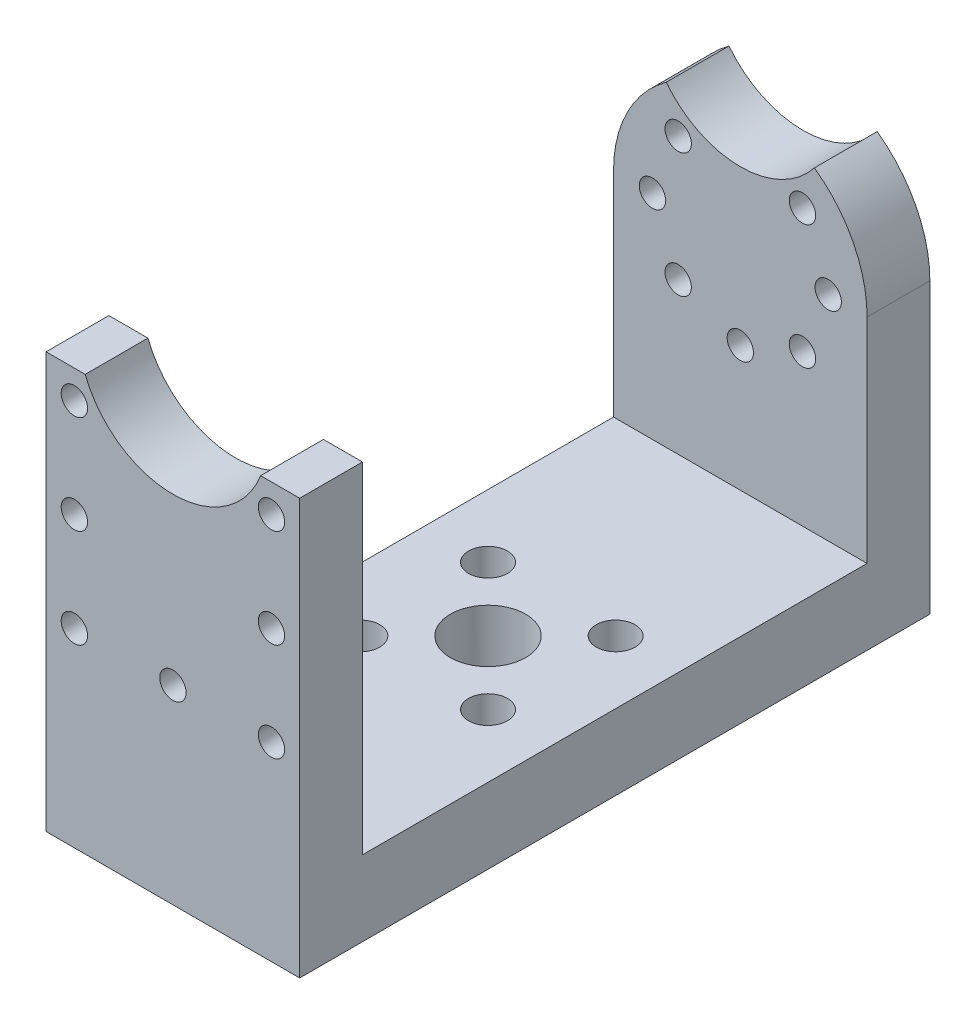
ISO-10303-21;
HEADER;
FILE_DESCRIPTION(('STEP AP214'),'2;1');
FILE_NAME('part.step','',(''),(''),'','','');
FILE_SCHEMA(('AUTOMOTIVE_DESIGN { 1 0 10303 214 1 1 1 1 }'));
ENDSEC;
DATA;
#1=APPLICATION_CONTEXT('core data for automotive mechanical design processes');
#2=APPLICATION_PROTOCOL_DEFINITION('international standard','automotive_design',2000,#1);
#3=PRODUCT_CONTEXT('',#1,'mechanical');
#4=PRODUCT('Part','Part','',(#3));
#5=PRODUCT_RELATED_PRODUCT_CATEGORY('part','',(#4));
#6=PRODUCT_DEFINITION_FORMATION('','',#4);
#7=PRODUCT_DEFINITION_CONTEXT('part definition',#1,'design');
#8=PRODUCT_DEFINITION('design','',#6,#7);
#9=PRODUCT_DEFINITION_SHAPE('','',#8);
#10=(LENGTH_UNIT() NAMED_UNIT(*) SI_UNIT(.MILLI.,.METRE.));
#11=(NAMED_UNIT(*) PLANE_ANGLE_UNIT() SI_UNIT($,.RADIAN.));
#12=(NAMED_UNIT(*) SI_UNIT($,.STERADIAN.) SOLID_ANGLE_UNIT());
#13=UNCERTAINTY_MEASURE_WITH_UNIT(LENGTH_MEASURE(1.E-05),#10,'distance_accuracy_value','');
#14=(GEOMETRIC_REPRESENTATION_CONTEXT(3) GLOBAL_UNCERTAINTY_ASSIGNED_CONTEXT((#13)) GLOBAL_UNIT_ASSIGNED_CONTEXT((#10,
#11,#12)) REPRESENTATION_CONTEXT('',''));
#15=CARTESIAN_POINT('',(0.,0.,0.));
#16=DIRECTION('',(0.,0.,1.));
#17=DIRECTION('',(1.,0.,0.));
#18=AXIS2_PLACEMENT_3D('',#15,#16,#17);
#19=CARTESIAN_POINT('',(0.,0.,50.2));
#20=DIRECTION('',(0.,0.,-1.));
#21=DIRECTION('',(-1.,0.,0.));
#22=AXIS2_PLACEMENT_3D('',#19,#20,#21);
#23=CYLINDRICAL_SURFACE('',#22,10.1);
#24=CARTESIAN_POINT('',(0.,0.,0.));
#25=DIRECTION('',(0.,0.,1.));
#26=DIRECTION('',(1.,0.,0.));
#27=AXIS2_PLACEMENT_3D('',#24,#25,#26);
#28=CIRCLE('',#27,10.1);
#29=CARTESIAN_POINT('',(10.1,0.,0.));
#30=VERTEX_POINT('',#29);
#31=CARTESIAN_POINT('',(5.90395674610825,8.19471138845554,0.));
#32=VERTEX_POINT('',#31);
#33=EDGE_CURVE('E261',#30,#32,#28,.T.);
#34=ORIENTED_EDGE('',*,*,#33,.T.);
#35=DIRECTION('',(0.,0.,-1.));
#36=VECTOR('',#35,1.);
#37=CARTESIAN_POINT('',(5.90395674610825,8.19471138845554,0.));
#38=LINE('',#37,#36);
#39=CARTESIAN_POINT('',(5.90395674610825,8.19471138845554,5.));
#40=VERTEX_POINT('',#39);
#41=EDGE_CURVE('E164',#32,#40,#38,.F.);
#42=ORIENTED_EDGE('',*,*,#41,.T.);
#43=CARTESIAN_POINT('',(0.,0.,5.));
#44=DIRECTION('',(0.,0.,-1.));
#45=DIRECTION('',(0.,1.,0.));
#46=AXIS2_PLACEMENT_3D('',#43,#44,#45);
#47=CIRCLE('',#46,10.1);
#48=CARTESIAN_POINT('',(10.1,0.,5.));
#49=VERTEX_POINT('',#48);
#50=EDGE_CURVE('E253',#40,#49,#47,.T.);
#51=ORIENTED_EDGE('',*,*,#50,.T.);
#52=DIRECTION('',(0.,0.,-1.));
#53=VECTOR('',#52,1.);
#54=CARTESIAN_POINT('',(10.1,0.,50.2));
#55=LINE('',#54,#53);
#56=EDGE_CURVE('E137',#49,#30,#55,.T.);
#57=ORIENTED_EDGE('',*,*,#56,.T.);
#58=EDGE_LOOP('',(#34,#42,#51,#57));
#59=FACE_BOUND('',#58,.T.);
#60=ADVANCED_FACE('F35',(#59),#23,.T.);
#61=CARTESIAN_POINT('',(-10.1,10.1,45.2));
#62=DIRECTION('',(0.,1.,0.));
#63=DIRECTION('',(0.,0.,1.));
#64=AXIS2_PLACEMENT_3D('',#61,#62,#63);
#65=PLANE('',#64);
#66=DIRECTION('',(0.,0.,1.));
#67=VECTOR('',#66,1.);
#68=CARTESIAN_POINT('',(-6.98939196210944,10.1,39.2));
#69=LINE('',#68,#67);
#70=CARTESIAN_POINT('',(-6.98939196210944,10.1,45.2));
#71=VERTEX_POINT('',#70);
#72=CARTESIAN_POINT('',(-6.98939196210944,10.1,50.2));
#73=VERTEX_POINT('',#72);
#74=EDGE_CURVE('E44',#71,#73,#69,.T.);
#75=ORIENTED_EDGE('',*,*,#74,.F.);
#76=DIRECTION('',(-1.,0.,0.));
#77=VECTOR('',#76,1.);
#78=CARTESIAN_POINT('',(-10.1,10.1,45.2));
#79=LINE('',#78,#77);
#80=CARTESIAN_POINT('',(-10.1,10.1,45.2));
#81=VERTEX_POINT('',#80);
#82=EDGE_CURVE('E235',#71,#81,#79,.T.);
#83=ORIENTED_EDGE('',*,*,#82,.T.);
#84=DIRECTION('',(0.,0.,1.));
#85=VECTOR('',#84,1.);
#86=CARTESIAN_POINT('',(-10.1,10.1,45.2));
#87=LINE('',#86,#85);
#88=CARTESIAN_POINT('',(-10.1,10.1,50.2));
#89=VERTEX_POINT('',#88);
#90=EDGE_CURVE('E234',#81,#89,#87,.T.);
#91=ORIENTED_EDGE('',*,*,#90,.T.);
#92=DIRECTION('',(-1.,0.,0.));
#93=VECTOR('',#92,1.);
#94=CARTESIAN_POINT('',(-10.1,10.1,50.2));
#95=LINE('',#94,#93);
#96=EDGE_CURVE('E230',#73,#89,#95,.T.);
#97=ORIENTED_EDGE('',*,*,#96,.F.);
#98=EDGE_LOOP('',(#75,#83,#91,#97));
#99=FACE_BOUND('',#98,.T.);
#100=ADVANCED_FACE('F396',(#99),#65,.T.);
#101=CARTESIAN_POINT('',(-10.1,0.,5.));
#102=VERTEX_POINT('',#101);
#103=CARTESIAN_POINT('',(-5.90395674610825,8.19471138845554,5.));
#104=VERTEX_POINT('',#103);
#105=EDGE_CURVE('E255',#102,#104,#47,.T.);
#106=ORIENTED_EDGE('',*,*,#105,.T.);
#107=DIRECTION('',(0.,0.,-1.));
#108=VECTOR('',#107,1.);
#109=CARTESIAN_POINT('',(-5.90395674610825,8.19471138845554,0.));
#110=LINE('',#109,#108);
#111=CARTESIAN_POINT('',(-5.90395674610825,8.19471138845554,0.));
#112=VERTEX_POINT('',#111);
#113=EDGE_CURVE('E52',#104,#112,#110,.T.);
#114=ORIENTED_EDGE('',*,*,#113,.T.);
#115=CARTESIAN_POINT('',(-10.1,0.,0.));
#116=VERTEX_POINT('',#115);
#117=EDGE_CURVE('E258',#112,#116,#28,.T.);
#118=ORIENTED_EDGE('',*,*,#117,.T.);
#119=DIRECTION('',(0.,0.,-1.));
#120=VECTOR('',#119,1.);
#121=CARTESIAN_POINT('',(-10.1,0.,50.2));
#122=LINE('',#121,#120);
#123=EDGE_CURVE('E268',#102,#116,#122,.T.);
#124=ORIENTED_EDGE('',*,*,#123,.F.);
#125=EDGE_LOOP('',(#106,#114,#118,#124));
#126=FACE_BOUND('',#125,.T.);
#127=ADVANCED_FACE('F37',(#126),#23,.T.);
#128=CARTESIAN_POINT('',(-10.1,0.,50.2));
#129=DIRECTION('',(1.,0.,0.));
#130=DIRECTION('',(0.,0.,-1.));
#131=AXIS2_PLACEMENT_3D('',#128,#129,#130);
#132=PLANE('',#131);
#133=DIRECTION('',(0.,-1.,0.));
#134=VECTOR('',#133,1.);
#135=CARTESIAN_POINT('',(-10.1,0.,50.2));
#136=LINE('',#135,#134);
#137=CARTESIAN_POINT('',(-10.1,-23.,50.2));
#138=VERTEX_POINT('',#137);
#139=EDGE_CURVE('E138',#89,#138,#136,.T.);
#140=ORIENTED_EDGE('',*,*,#139,.F.);
#141=ORIENTED_EDGE('',*,*,#90,.F.);
#142=DIRECTION('',(0.,1.,0.));
#143=VECTOR('',#142,1.);
#144=CARTESIAN_POINT('',(-10.1,-17.,45.2));
#145=LINE('',#144,#143);
#146=CARTESIAN_POINT('',(-10.1,-17.,45.2));
#147=VERTEX_POINT('',#146);
#148=EDGE_CURVE('E247',#147,#81,#145,.T.);
#149=ORIENTED_EDGE('',*,*,#148,.F.);
#150=DIRECTION('',(0.,0.,1.));
#151=VECTOR('',#150,1.);
#152=CARTESIAN_POINT('',(-10.1,-17.,5.));
#153=LINE('',#152,#151);
#154=CARTESIAN_POINT('',(-10.1,-17.,5.));
#155=VERTEX_POINT('',#154);
#156=EDGE_CURVE('E244',#155,#147,#153,.T.);
#157=ORIENTED_EDGE('',*,*,#156,.F.);
#158=DIRECTION('',(0.,-1.,0.));
#159=VECTOR('',#158,1.);
#160=CARTESIAN_POINT('',(-10.1,-10.,5.));
#161=LINE('',#160,#159);
#162=EDGE_CURVE('E239',#102,#155,#161,.T.);
#163=ORIENTED_EDGE('',*,*,#162,.F.);
#164=ORIENTED_EDGE('',*,*,#123,.T.);
#165=DIRECTION('',(0.,-1.,0.));
#166=VECTOR('',#165,1.);
#167=CARTESIAN_POINT('',(-10.1,0.,0.));
#168=LINE('',#167,#166);
#169=CARTESIAN_POINT('',(-10.1,-23.,0.));
#170=VERTEX_POINT('',#169);
#171=EDGE_CURVE('E264',#116,#170,#168,.T.);
#172=ORIENTED_EDGE('',*,*,#171,.T.);
#173=DIRECTION('',(0.,0.,-1.));
#174=VECTOR('',#173,1.);
#175=CARTESIAN_POINT('',(-10.1,-23.,0.));
#176=LINE('',#175,#174);
#177=EDGE_CURVE('E148',#138,#170,#176,.T.);
#178=ORIENTED_EDGE('',*,*,#177,.F.);
#179=EDGE_LOOP('',(#140,#141,#149,#157,#163,#164,#172,#178));
#180=FACE_BOUND('',#179,.T.);
#181=ADVANCED_FACE('F380',(#180),#132,.F.);
#182=CARTESIAN_POINT('',(10.1,0.,50.2));
#183=DIRECTION('',(-1.,0.,0.));
#184=DIRECTION('',(0.,0.,1.));
#185=AXIS2_PLACEMENT_3D('',#182,#183,#184);
#186=PLANE('',#185);
#187=DIRECTION('',(0.,0.,1.));
#188=VECTOR('',#187,1.);
#189=CARTESIAN_POINT('',(10.1,-17.,50.2));
#190=LINE('',#189,#188);
#191=CARTESIAN_POINT('',(10.1,-17.,5.));
#192=VERTEX_POINT('',#191);
#193=CARTESIAN_POINT('',(10.1,-17.,45.2));
#194=VERTEX_POINT('',#193);
#195=EDGE_CURVE('E274',#192,#194,#190,.T.);
#196=ORIENTED_EDGE('',*,*,#195,.T.);
#197=DIRECTION('',(0.,1.,0.));
#198=VECTOR('',#197,1.);
#199=CARTESIAN_POINT('',(10.1,0.,45.2));
#200=LINE('',#199,#198);
#201=CARTESIAN_POINT('',(10.1,10.1,45.2));
#202=VERTEX_POINT('',#201);
#203=EDGE_CURVE('E276',#194,#202,#200,.T.);
#204=ORIENTED_EDGE('',*,*,#203,.T.);
#205=DIRECTION('',(0.,0.,1.));
#206=VECTOR('',#205,1.);
#207=CARTESIAN_POINT('',(10.1,10.1,45.2));
#208=LINE('',#207,#206);
#209=CARTESIAN_POINT('',(10.1,10.1,50.2));
#210=VERTEX_POINT('',#209);
#211=EDGE_CURVE('E134',#202,#210,#208,.T.);
#212=ORIENTED_EDGE('',*,*,#211,.T.);
#213=DIRECTION('',(0.,1.,0.));
#214=VECTOR('',#213,1.);
#215=CARTESIAN_POINT('',(10.1,0.,50.2));
#216=LINE('',#215,#214);
#217=CARTESIAN_POINT('',(10.1,-23.,50.2));
#218=VERTEX_POINT('',#217);
#219=EDGE_CURVE('E126',#218,#210,#216,.T.);
#220=ORIENTED_EDGE('',*,*,#219,.F.);
#221=DIRECTION('',(0.,0.,1.));
#222=VECTOR('',#221,1.);
#223=CARTESIAN_POINT('',(10.1,-23.,0.));
#224=LINE('',#223,#222);
#225=CARTESIAN_POINT('',(10.1,-23.,0.));
#226=VERTEX_POINT('',#225);
#227=EDGE_CURVE('E132',#226,#218,#224,.T.);
#228=ORIENTED_EDGE('',*,*,#227,.F.);
#229=DIRECTION('',(0.,1.,0.));
#230=VECTOR('',#229,1.);
#231=CARTESIAN_POINT('',(10.1,0.,0.));
#232=LINE('',#231,#230);
#233=EDGE_CURVE('E259',#226,#30,#232,.T.);
#234=ORIENTED_EDGE('',*,*,#233,.T.);
#235=ORIENTED_EDGE('',*,*,#56,.F.);
#236=DIRECTION('',(0.,-1.,0.));
#237=VECTOR('',#236,1.);
#238=CARTESIAN_POINT('',(10.1,0.,5.));
#239=LINE('',#238,#237);
#240=EDGE_CURVE('E271',#49,#192,#239,.T.);
#241=ORIENTED_EDGE('',*,*,#240,.T.);
#242=EDGE_LOOP('',(#196,#204,#212,#220,#228,#234,#235,#241));
#243=FACE_BOUND('',#242,.T.);
#244=ADVANCED_FACE('F129',(#243),#186,.F.);
#245=CARTESIAN_POINT('',(0.,0.,50.2));
#246=DIRECTION('',(0.,0.,1.));
#247=DIRECTION('',(1.,0.,0.));
#248=AXIS2_PLACEMENT_3D('',#245,#246,#247);
#249=PLANE('',#248);
#250=CARTESIAN_POINT('',(0.,12.82,50.2));
#251=DIRECTION('',(0.,0.,1.));
#252=DIRECTION('',(1.,0.,0.));
#253=AXIS2_PLACEMENT_3D('',#250,#251,#252);
#254=CIRCLE('',#253,7.5);
#255=CARTESIAN_POINT('',(6.98939196210944,10.1,50.2));
#256=VERTEX_POINT('',#255);
#257=EDGE_CURVE('E59',#73,#256,#254,.T.);
#258=ORIENTED_EDGE('',*,*,#257,.F.);
#259=ORIENTED_EDGE('',*,*,#96,.T.);
#260=ORIENTED_EDGE('',*,*,#139,.T.);
#261=DIRECTION('',(-1.,0.,0.));
#262=VECTOR('',#261,1.);
#263=CARTESIAN_POINT('',(10.1,-23.,50.2));
#264=LINE('',#263,#262);
#265=EDGE_CURVE('E141',#218,#138,#264,.T.);
#266=ORIENTED_EDGE('',*,*,#265,.F.);
#267=ORIENTED_EDGE('',*,*,#219,.T.);
#268=EDGE_CURVE('E236',#210,#256,#95,.T.);
#269=ORIENTED_EDGE('',*,*,#268,.T.);
#270=EDGE_LOOP('',(#258,#259,#260,#266,#267,#269));
#271=FACE_BOUND('',#270,.T.);
#272=CARTESIAN_POINT('',(7.85,-7.85,50.2));
#273=DIRECTION('',(0.,0.,1.));
#274=DIRECTION('',(1.,0.,0.));
#275=AXIS2_PLACEMENT_3D('',#272,#273,#274);
#276=CIRCLE('',#275,1.05);
#277=CARTESIAN_POINT('',(8.9,-7.85,50.2));
#278=VERTEX_POINT('',#277);
#279=EDGE_CURVE('E227',#278,#278,#276,.T.);
#280=ORIENTED_EDGE('',*,*,#279,.F.);
#281=EDGE_LOOP('',(#280));
#282=FACE_BOUND('',#281,.T.);
#283=CARTESIAN_POINT('',(-7.85,-7.85,50.2));
#284=DIRECTION('',(0.,0.,1.));
#285=DIRECTION('',(1.,0.,0.));
#286=AXIS2_PLACEMENT_3D('',#283,#284,#285);
#287=CIRCLE('',#286,1.05);
#288=CARTESIAN_POINT('',(-6.8,-7.85,50.2));
#289=VERTEX_POINT('',#288);
#290=EDGE_CURVE('E223',#289,#289,#287,.T.);
#291=ORIENTED_EDGE('',*,*,#290,.F.);
#292=EDGE_LOOP('',(#291));
#293=FACE_BOUND('',#292,.T.);
#294=CARTESIAN_POINT('',(7.85,7.85,50.2));
#295=DIRECTION('',(0.,0.,1.));
#296=DIRECTION('',(1.,0.,0.));
#297=AXIS2_PLACEMENT_3D('',#294,#295,#296);
#298=CIRCLE('',#297,1.05);
#299=CARTESIAN_POINT('',(8.9,7.85,50.2));
#300=VERTEX_POINT('',#299);
#301=EDGE_CURVE('E219',#300,#300,#298,.T.);
#302=ORIENTED_EDGE('',*,*,#301,.F.);
#303=EDGE_LOOP('',(#302));
#304=FACE_BOUND('',#303,.T.);
#305=CARTESIAN_POINT('',(0.,-7.85,50.2));
#306=DIRECTION('',(0.,0.,1.));
#307=DIRECTION('',(1.,0.,0.));
#308=AXIS2_PLACEMENT_3D('',#305,#306,#307);
#309=CIRCLE('',#308,1.05);
#310=CARTESIAN_POINT('',(1.05,-7.85,50.2));
#311=VERTEX_POINT('',#310);
#312=EDGE_CURVE('E215',#311,#311,#309,.T.);
#313=ORIENTED_EDGE('',*,*,#312,.F.);
#314=EDGE_LOOP('',(#313));
#315=FACE_BOUND('',#314,.T.);
#316=CARTESIAN_POINT('',(-7.85,0.,50.2));
#317=DIRECTION('',(0.,0.,1.));
#318=DIRECTION('',(1.,0.,0.));
#319=AXIS2_PLACEMENT_3D('',#316,#317,#318);
#320=CIRCLE('',#319,1.05);
#321=CARTESIAN_POINT('',(-6.8,0.,50.2));
#322=VERTEX_POINT('',#321);
#323=EDGE_CURVE('E211',#322,#322,#320,.T.);
#324=ORIENTED_EDGE('',*,*,#323,.F.);
#325=EDGE_LOOP('',(#324));
#326=FACE_BOUND('',#325,.T.);
#327=CARTESIAN_POINT('',(7.85,0.,50.2));
#328=DIRECTION('',(0.,0.,1.));
#329=DIRECTION('',(1.,0.,0.));
#330=AXIS2_PLACEMENT_3D('',#327,#328,#329);
#331=CIRCLE('',#330,1.05);
#332=CARTESIAN_POINT('',(8.9,0.,50.2));
#333=VERTEX_POINT('',#332);
#334=EDGE_CURVE('E207',#333,#333,#331,.T.);
#335=ORIENTED_EDGE('',*,*,#334,.F.);
#336=EDGE_LOOP('',(#335));
#337=FACE_BOUND('',#336,.T.);
#338=CARTESIAN_POINT('',(-7.85,7.85,50.2));
#339=DIRECTION('',(0.,0.,1.));
#340=DIRECTION('',(1.,0.,0.));
#341=AXIS2_PLACEMENT_3D('',#338,#339,#340);
#342=CIRCLE('',#341,1.05);
#343=CARTESIAN_POINT('',(-6.8,7.85,50.2));
#344=VERTEX_POINT('',#343);
#345=EDGE_CURVE('E203',#344,#344,#342,.T.);
#346=ORIENTED_EDGE('',*,*,#345,.F.);
#347=EDGE_LOOP('',(#346));
#348=FACE_BOUND('',#347,.T.);
#349=ADVANCED_FACE('F142',(#271,#282,#293,#304,#315,#326,#337,#348),#249,.T.);
#350=CARTESIAN_POINT('',(0.,0.,0.));
#351=DIRECTION('',(0.,0.,1.));
#352=DIRECTION('',(1.,0.,0.));
#353=AXIS2_PLACEMENT_3D('',#350,#351,#352);
#354=PLANE('',#353);
#355=CARTESIAN_POINT('',(4.94974746830575,4.94974746830562,0.));
#356=DIRECTION('',(0.,0.,1.));
#357=DIRECTION('',(1.,0.,0.));
#358=AXIS2_PLACEMENT_3D('',#355,#356,#357);
#359=CIRCLE('',#358,1.05000000000013);
#360=CARTESIAN_POINT('',(5.99974746830588,4.94974746830562,0.));
#361=VERTEX_POINT('',#360);
#362=EDGE_CURVE('E195',#361,#361,#359,.T.);
#363=ORIENTED_EDGE('',*,*,#362,.T.);
#364=EDGE_LOOP('',(#363));
#365=FACE_BOUND('',#364,.T.);
#366=CARTESIAN_POINT('',(6.9999999999997,-2.96284817120734E-13,0.));
#367=DIRECTION('',(0.,0.,1.));
#368=DIRECTION('',(1.,0.,0.));
#369=AXIS2_PLACEMENT_3D('',#366,#367,#368);
#370=CIRCLE('',#369,1.05000000000035);
#371=CARTESIAN_POINT('',(8.05000000000005,-2.96284817120734E-13,0.));
#372=VERTEX_POINT('',#371);
#373=EDGE_CURVE('E191',#372,#372,#370,.T.);
#374=ORIENTED_EDGE('',*,*,#373,.T.);
#375=EDGE_LOOP('',(#374));
#376=FACE_BOUND('',#375,.T.);
#377=CARTESIAN_POINT('',(4.94974746830533,-4.94974746830604,0.));
#378=DIRECTION('',(0.,0.,1.));
#379=DIRECTION('',(1.,0.,0.));
#380=AXIS2_PLACEMENT_3D('',#377,#378,#379);
#381=CIRCLE('',#380,1.05000000000051);
#382=CARTESIAN_POINT('',(5.99974746830584,-4.94974746830604,0.));
#383=VERTEX_POINT('',#382);
#384=EDGE_CURVE('E187',#383,#383,#381,.T.);
#385=ORIENTED_EDGE('',*,*,#384,.T.);
#386=EDGE_LOOP('',(#385));
#387=FACE_BOUND('',#386,.T.);
#388=CARTESIAN_POINT('',(-5.92569634241468E-13,-7.,0.));
#389=DIRECTION('',(0.,0.,1.));
#390=DIRECTION('',(1.,0.,0.));
#391=AXIS2_PLACEMENT_3D('',#388,#389,#390);
#392=CIRCLE('',#391,1.05000000000052);
#393=CARTESIAN_POINT('',(1.04999999999993,-7.,0.));
#394=VERTEX_POINT('',#393);
#395=EDGE_CURVE('E183',#394,#394,#392,.T.);
#396=ORIENTED_EDGE('',*,*,#395,.T.);
#397=EDGE_LOOP('',(#396));
#398=FACE_BOUND('',#397,.T.);
#399=CARTESIAN_POINT('',(-4.94974746830634,-4.94974746830562,0.));
#400=DIRECTION('',(0.,0.,1.));
#401=DIRECTION('',(1.,0.,0.));
#402=AXIS2_PLACEMENT_3D('',#399,#400,#401);
#403=CIRCLE('',#402,1.05000000000036);
#404=CARTESIAN_POINT('',(-3.89974746830598,-4.94974746830562,0.));
#405=VERTEX_POINT('',#404);
#406=EDGE_CURVE('E179',#405,#405,#403,.T.);
#407=ORIENTED_EDGE('',*,*,#406,.T.);
#408=EDGE_LOOP('',(#407));
#409=FACE_BOUND('',#408,.T.);
#410=CARTESIAN_POINT('',(-7.0000000000003,2.95427564361331E-13,0.));
#411=DIRECTION('',(0.,0.,1.));
#412=DIRECTION('',(1.,0.,0.));
#413=AXIS2_PLACEMENT_3D('',#410,#411,#412);
#414=CIRCLE('',#413,1.05000000000013);
#415=CARTESIAN_POINT('',(-5.95000000000017,2.95427564361331E-13,0.));
#416=VERTEX_POINT('',#415);
#417=EDGE_CURVE('E175',#416,#416,#414,.T.);
#418=ORIENTED_EDGE('',*,*,#417,.T.);
#419=EDGE_LOOP('',(#418));
#420=FACE_BOUND('',#419,.T.);
#421=CARTESIAN_POINT('',(-4.94974746830592,4.94974746830604,0.));
#422=DIRECTION('',(0.,0.,1.));
#423=DIRECTION('',(1.,0.,0.));
#424=AXIS2_PLACEMENT_3D('',#421,#422,#423);
#425=CIRCLE('',#424,1.04999999999994);
#426=CARTESIAN_POINT('',(-3.89974746830598,4.94974746830604,0.));
#427=VERTEX_POINT('',#426);
#428=EDGE_CURVE('E171',#427,#427,#425,.T.);
#429=ORIENTED_EDGE('',*,*,#428,.T.);
#430=EDGE_LOOP('',(#429));
#431=FACE_BOUND('',#430,.T.);
#432=ORIENTED_EDGE('',*,*,#117,.F.);
#433=CARTESIAN_POINT('',(0.,12.82,0.));
#434=DIRECTION('',(0.,0.,1.));
#435=DIRECTION('',(1.,0.,0.));
#436=AXIS2_PLACEMENT_3D('',#433,#434,#435);
#437=CIRCLE('',#436,7.5);
#438=EDGE_CURVE('E167',#112,#32,#437,.T.);
#439=ORIENTED_EDGE('',*,*,#438,.T.);
#440=ORIENTED_EDGE('',*,*,#33,.F.);
#441=ORIENTED_EDGE('',*,*,#233,.F.);
#442=DIRECTION('',(1.,0.,0.));
#443=VECTOR('',#442,1.);
#444=CARTESIAN_POINT('',(10.1,-23.,0.));
#445=LINE('',#444,#443);
#446=EDGE_CURVE('E153',#170,#226,#445,.T.);
#447=ORIENTED_EDGE('',*,*,#446,.F.);
#448=ORIENTED_EDGE('',*,*,#171,.F.);
#449=EDGE_LOOP('',(#432,#439,#440,#441,#447,#448));
#450=FACE_BOUND('',#449,.T.);
#451=ADVANCED_FACE('F390',(#365,#376,#387,#398,#409,#420,#431,#450),#354,.F.);
#452=CARTESIAN_POINT('',(34.1,-17.,45.2));
#453=DIRECTION('',(0.,0.,1.));
#454=DIRECTION('',(1.,0.,0.));
#455=AXIS2_PLACEMENT_3D('',#452,#453,#454);
#456=PLANE('',#455);
#457=CARTESIAN_POINT('',(7.85,-7.85,45.2));
#458=DIRECTION('',(0.,0.,1.));
#459=DIRECTION('',(1.,0.,0.));
#460=AXIS2_PLACEMENT_3D('',#457,#458,#459);
#461=CIRCLE('',#460,1.05);
#462=CARTESIAN_POINT('',(8.9,-7.85,45.2));
#463=VERTEX_POINT('',#462);
#464=EDGE_CURVE('E226',#463,#463,#461,.T.);
#465=ORIENTED_EDGE('',*,*,#464,.T.);
#466=EDGE_LOOP('',(#465));
#467=FACE_BOUND('',#466,.T.);
#468=CARTESIAN_POINT('',(-7.85,-7.85,45.2));
#469=DIRECTION('',(0.,0.,1.));
#470=DIRECTION('',(1.,0.,0.));
#471=AXIS2_PLACEMENT_3D('',#468,#469,#470);
#472=CIRCLE('',#471,1.05);
#473=CARTESIAN_POINT('',(-6.8,-7.85,45.2));
#474=VERTEX_POINT('',#473);
#475=EDGE_CURVE('E222',#474,#474,#472,.T.);
#476=ORIENTED_EDGE('',*,*,#475,.T.);
#477=EDGE_LOOP('',(#476));
#478=FACE_BOUND('',#477,.T.);
#479=CARTESIAN_POINT('',(7.85,7.85,45.2));
#480=DIRECTION('',(0.,0.,1.));
#481=DIRECTION('',(1.,0.,0.));
#482=AXIS2_PLACEMENT_3D('',#479,#480,#481);
#483=CIRCLE('',#482,1.05);
#484=CARTESIAN_POINT('',(8.9,7.85,45.2));
#485=VERTEX_POINT('',#484);
#486=EDGE_CURVE('E218',#485,#485,#483,.T.);
#487=ORIENTED_EDGE('',*,*,#486,.T.);
#488=EDGE_LOOP('',(#487));
#489=FACE_BOUND('',#488,.T.);
#490=CARTESIAN_POINT('',(0.,-7.85,45.2));
#491=DIRECTION('',(0.,0.,1.));
#492=DIRECTION('',(1.,0.,0.));
#493=AXIS2_PLACEMENT_3D('',#490,#491,#492);
#494=CIRCLE('',#493,1.05);
#495=CARTESIAN_POINT('',(1.05,-7.85,45.2));
#496=VERTEX_POINT('',#495);
#497=EDGE_CURVE('E214',#496,#496,#494,.T.);
#498=ORIENTED_EDGE('',*,*,#497,.T.);
#499=EDGE_LOOP('',(#498));
#500=FACE_BOUND('',#499,.T.);
#501=CARTESIAN_POINT('',(-7.85,0.,45.2));
#502=DIRECTION('',(0.,0.,1.));
#503=DIRECTION('',(1.,0.,0.));
#504=AXIS2_PLACEMENT_3D('',#501,#502,#503);
#505=CIRCLE('',#504,1.05);
#506=CARTESIAN_POINT('',(-6.8,0.,45.2));
#507=VERTEX_POINT('',#506);
#508=EDGE_CURVE('E210',#507,#507,#505,.T.);
#509=ORIENTED_EDGE('',*,*,#508,.T.);
#510=EDGE_LOOP('',(#509));
#511=FACE_BOUND('',#510,.T.);
#512=CARTESIAN_POINT('',(7.85,0.,45.2));
#513=DIRECTION('',(0.,0.,1.));
#514=DIRECTION('',(1.,0.,0.));
#515=AXIS2_PLACEMENT_3D('',#512,#513,#514);
#516=CIRCLE('',#515,1.05);
#517=CARTESIAN_POINT('',(8.9,0.,45.2));
#518=VERTEX_POINT('',#517);
#519=EDGE_CURVE('E206',#518,#518,#516,.T.);
#520=ORIENTED_EDGE('',*,*,#519,.T.);
#521=EDGE_LOOP('',(#520));
#522=FACE_BOUND('',#521,.T.);
#523=CARTESIAN_POINT('',(-7.85,7.85,45.2));
#524=DIRECTION('',(0.,0.,1.));
#525=DIRECTION('',(1.,0.,0.));
#526=AXIS2_PLACEMENT_3D('',#523,#524,#525);
#527=CIRCLE('',#526,1.05);
#528=CARTESIAN_POINT('',(-6.8,7.85,45.2));
#529=VERTEX_POINT('',#528);
#530=EDGE_CURVE('E202',#529,#529,#527,.T.);
#531=ORIENTED_EDGE('',*,*,#530,.T.);
#532=EDGE_LOOP('',(#531));
#533=FACE_BOUND('',#532,.T.);
#534=ORIENTED_EDGE('',*,*,#82,.F.);
#535=CARTESIAN_POINT('',(0.,12.82,45.2));
#536=DIRECTION('',(0.,0.,1.));
#537=DIRECTION('',(1.,0.,0.));
#538=AXIS2_PLACEMENT_3D('',#535,#536,#537);
#539=CIRCLE('',#538,7.5);
#540=CARTESIAN_POINT('',(6.98939196210944,10.1,45.2));
#541=VERTEX_POINT('',#540);
#542=EDGE_CURVE('E198',#71,#541,#539,.T.);
#543=ORIENTED_EDGE('',*,*,#542,.T.);
#544=EDGE_CURVE('E231',#202,#541,#79,.T.);
#545=ORIENTED_EDGE('',*,*,#544,.F.);
#546=ORIENTED_EDGE('',*,*,#203,.F.);
#547=DIRECTION('',(-1.,0.,0.));
#548=VECTOR('',#547,1.);
#549=CARTESIAN_POINT('',(34.1,-17.,45.2));
#550=LINE('',#549,#548);
#551=EDGE_CURVE('E251',#194,#147,#550,.T.);
#552=ORIENTED_EDGE('',*,*,#551,.T.);
#553=ORIENTED_EDGE('',*,*,#148,.T.);
#554=EDGE_LOOP('',(#534,#543,#545,#546,#552,#553));
#555=FACE_BOUND('',#554,.T.);
#556=ADVANCED_FACE('F363',(#467,#478,#489,#500,#511,#522,#533,#555),#456,.F.);
#557=CARTESIAN_POINT('',(34.1,-17.,5.));
#558=DIRECTION('',(0.,-1.,0.));
#559=DIRECTION('',(0.,0.,-1.));
#560=AXIS2_PLACEMENT_3D('',#557,#558,#559);
#561=PLANE('',#560);
#562=CARTESIAN_POINT('',(-5.08409775673116,-17.,30.1840977567312));
#563=DIRECTION('',(0.,1.,0.));
#564=DIRECTION('',(0.,0.,1.));
#565=AXIS2_PLACEMENT_3D('',#562,#563,#564);
#566=CIRCLE('',#565,1.54999999999999);
#567=CARTESIAN_POINT('',(-5.08409775673116,-17.,31.7340977567312));
#568=VERTEX_POINT('',#567);
#569=EDGE_CURVE('E353',#568,#568,#566,.T.);
#570=ORIENTED_EDGE('',*,*,#569,.F.);
#571=EDGE_LOOP('',(#570));
#572=FACE_BOUND('',#571,.T.);
#573=CARTESIAN_POINT('',(5.08409775673141,-17.,30.1840977567311));
#574=DIRECTION('',(0.,1.,0.));
#575=DIRECTION('',(0.,0.,1.));
#576=AXIS2_PLACEMENT_3D('',#573,#574,#575);
#577=CIRCLE('',#576,1.54999999999999);
#578=CARTESIAN_POINT('',(5.08409775673141,-17.,31.7340977567311));
#579=VERTEX_POINT('',#578);
#580=EDGE_CURVE('E349',#579,#579,#577,.T.);
#581=ORIENTED_EDGE('',*,*,#580,.F.);
#582=EDGE_LOOP('',(#581));
#583=FACE_BOUND('',#582,.T.);
#584=CARTESIAN_POINT('',(5.08409775673127,-17.,20.0159022432686));
#585=DIRECTION('',(0.,1.,0.));
#586=DIRECTION('',(0.,0.,1.));
#587=AXIS2_PLACEMENT_3D('',#584,#585,#586);
#588=CIRCLE('',#587,1.54999999999999);
#589=CARTESIAN_POINT('',(5.08409775673127,-17.,21.5659022432686));
#590=VERTEX_POINT('',#589);
#591=EDGE_CURVE('E344',#590,#590,#588,.T.);
#592=ORIENTED_EDGE('',*,*,#591,.F.);
#593=EDGE_LOOP('',(#592));
#594=FACE_BOUND('',#593,.T.);
#595=CARTESIAN_POINT('',(-5.0840977567313,-17.,20.0159022432687));
#596=DIRECTION('',(0.,1.,0.));
#597=DIRECTION('',(0.,0.,1.));
#598=AXIS2_PLACEMENT_3D('',#595,#596,#597);
#599=CIRCLE('',#598,1.54999999999999);
#600=CARTESIAN_POINT('',(-5.0840977567313,-17.,21.5659022432687));
#601=VERTEX_POINT('',#600);
#602=EDGE_CURVE('E342',#601,#601,#599,.T.);
#603=ORIENTED_EDGE('',*,*,#602,.F.);
#604=EDGE_LOOP('',(#603));
#605=FACE_BOUND('',#604,.T.);
#606=CARTESIAN_POINT('',(0.,-17.,25.1));
#607=DIRECTION('',(0.,1.,0.));
#608=DIRECTION('',(0.,0.,1.));
#609=AXIS2_PLACEMENT_3D('',#606,#607,#608);
#610=CIRCLE('',#609,3.);
#611=CARTESIAN_POINT('',(0.,-17.,28.1));
#612=VERTEX_POINT('',#611);
#613=EDGE_CURVE('E158',#612,#612,#610,.T.);
#614=ORIENTED_EDGE('',*,*,#613,.F.);
#615=EDGE_LOOP('',(#614));
#616=FACE_BOUND('',#615,.T.);
#617=DIRECTION('',(-1.,0.,0.));
#618=VECTOR('',#617,1.);
#619=CARTESIAN_POINT('',(34.1,-17.,5.));
#620=LINE('',#619,#618);
#621=EDGE_CURVE('E250',#192,#155,#620,.T.);
#622=ORIENTED_EDGE('',*,*,#621,.T.);
#623=ORIENTED_EDGE('',*,*,#156,.T.);
#624=ORIENTED_EDGE('',*,*,#551,.F.);
#625=ORIENTED_EDGE('',*,*,#195,.F.);
#626=EDGE_LOOP('',(#622,#623,#624,#625));
#627=FACE_BOUND('',#626,.T.);
#628=ADVANCED_FACE('F359',(#572,#583,#594,#605,#616,#627),#561,.F.);
#629=CARTESIAN_POINT('',(34.1,-10.,5.));
#630=DIRECTION('',(0.,0.,-1.));
#631=DIRECTION('',(0.,1.,0.));
#632=AXIS2_PLACEMENT_3D('',#629,#630,#631);
#633=PLANE('',#632);
#634=CARTESIAN_POINT('',(4.94974746830575,4.94974746830562,5.));
#635=DIRECTION('',(0.,0.,-1.));
#636=DIRECTION('',(0.,1.,0.));
#637=AXIS2_PLACEMENT_3D('',#634,#635,#636);
#638=CIRCLE('',#637,1.05000000000013);
#639=CARTESIAN_POINT('',(4.94974746830575,5.99974746830576,5.));
#640=VERTEX_POINT('',#639);
#641=EDGE_CURVE('E194',#640,#640,#638,.T.);
#642=ORIENTED_EDGE('',*,*,#641,.T.);
#643=EDGE_LOOP('',(#642));
#644=FACE_BOUND('',#643,.T.);
#645=CARTESIAN_POINT('',(6.9999999999997,-2.96284817120734E-13,5.));
#646=DIRECTION('',(0.,0.,-1.));
#647=DIRECTION('',(0.,1.,0.));
#648=AXIS2_PLACEMENT_3D('',#645,#646,#647);
#649=CIRCLE('',#648,1.05000000000035);
#650=CARTESIAN_POINT('',(6.9999999999997,1.05000000000005,5.));
#651=VERTEX_POINT('',#650);
#652=EDGE_CURVE('E190',#651,#651,#649,.T.);
#653=ORIENTED_EDGE('',*,*,#652,.T.);
#654=EDGE_LOOP('',(#653));
#655=FACE_BOUND('',#654,.T.);
#656=CARTESIAN_POINT('',(4.94974746830533,-4.94974746830604,5.));
#657=DIRECTION('',(0.,0.,-1.));
#658=DIRECTION('',(0.,1.,0.));
#659=AXIS2_PLACEMENT_3D('',#656,#657,#658);
#660=CIRCLE('',#659,1.05000000000051);
#661=CARTESIAN_POINT('',(4.94974746830533,-3.89974746830553,5.));
#662=VERTEX_POINT('',#661);
#663=EDGE_CURVE('E186',#662,#662,#660,.T.);
#664=ORIENTED_EDGE('',*,*,#663,.T.);
#665=EDGE_LOOP('',(#664));
#666=FACE_BOUND('',#665,.T.);
#667=CARTESIAN_POINT('',(-5.92569634241468E-13,-7.,5.));
#668=DIRECTION('',(0.,0.,-1.));
#669=DIRECTION('',(0.,1.,0.));
#670=AXIS2_PLACEMENT_3D('',#667,#668,#669);
#671=CIRCLE('',#670,1.05000000000052);
#672=CARTESIAN_POINT('',(-5.92569634241468E-13,-5.94999999999948,5.));
#673=VERTEX_POINT('',#672);
#674=EDGE_CURVE('E182',#673,#673,#671,.T.);
#675=ORIENTED_EDGE('',*,*,#674,.T.);
#676=EDGE_LOOP('',(#675));
#677=FACE_BOUND('',#676,.T.);
#678=CARTESIAN_POINT('',(-4.94974746830634,-4.94974746830562,5.));
#679=DIRECTION('',(0.,0.,-1.));
#680=DIRECTION('',(0.,1.,0.));
#681=AXIS2_PLACEMENT_3D('',#678,#679,#680);
#682=CIRCLE('',#681,1.05000000000036);
#683=CARTESIAN_POINT('',(-4.94974746830634,-3.89974746830526,5.));
#684=VERTEX_POINT('',#683);
#685=EDGE_CURVE('E178',#684,#684,#682,.T.);
#686=ORIENTED_EDGE('',*,*,#685,.T.);
#687=EDGE_LOOP('',(#686));
#688=FACE_BOUND('',#687,.T.);
#689=CARTESIAN_POINT('',(-7.0000000000003,2.95427564361331E-13,5.));
#690=DIRECTION('',(0.,0.,-1.));
#691=DIRECTION('',(0.,1.,0.));
#692=AXIS2_PLACEMENT_3D('',#689,#690,#691);
#693=CIRCLE('',#692,1.05000000000013);
#694=CARTESIAN_POINT('',(-7.0000000000003,1.05000000000042,5.));
#695=VERTEX_POINT('',#694);
#696=EDGE_CURVE('E174',#695,#695,#693,.T.);
#697=ORIENTED_EDGE('',*,*,#696,.T.);
#698=EDGE_LOOP('',(#697));
#699=FACE_BOUND('',#698,.T.);
#700=CARTESIAN_POINT('',(-4.94974746830592,4.94974746830604,5.));
#701=DIRECTION('',(0.,0.,-1.));
#702=DIRECTION('',(0.,1.,0.));
#703=AXIS2_PLACEMENT_3D('',#700,#701,#702);
#704=CIRCLE('',#703,1.04999999999994);
#705=CARTESIAN_POINT('',(-4.94974746830592,5.99974746830598,5.));
#706=VERTEX_POINT('',#705);
#707=EDGE_CURVE('E170',#706,#706,#704,.T.);
#708=ORIENTED_EDGE('',*,*,#707,.T.);
#709=EDGE_LOOP('',(#708));
#710=FACE_BOUND('',#709,.T.);
#711=ORIENTED_EDGE('',*,*,#50,.F.);
#712=CARTESIAN_POINT('',(0.,12.82,5.));
#713=DIRECTION('',(0.,0.,-1.));
#714=DIRECTION('',(0.,1.,0.));
#715=AXIS2_PLACEMENT_3D('',#712,#713,#714);
#716=CIRCLE('',#715,7.5);
#717=EDGE_CURVE('E11',#40,#104,#716,.T.);
#718=ORIENTED_EDGE('',*,*,#717,.T.);
#719=ORIENTED_EDGE('',*,*,#105,.F.);
#720=ORIENTED_EDGE('',*,*,#162,.T.);
#721=ORIENTED_EDGE('',*,*,#621,.F.);
#722=ORIENTED_EDGE('',*,*,#240,.F.);
#723=EDGE_LOOP('',(#711,#718,#719,#720,#721,#722));
#724=FACE_BOUND('',#723,.T.);
#725=ADVANCED_FACE('F362',(#644,#655,#666,#677,#688,#699,#710,#724),#633,.F.);
#726=DIRECTION('',(0.,0.,1.));
#727=VECTOR('',#726,1.);
#728=CARTESIAN_POINT('',(6.98939196210944,10.1,39.2));
#729=LINE('',#728,#727);
#730=EDGE_CURVE('E278',#256,#541,#729,.F.);
#731=ORIENTED_EDGE('',*,*,#730,.F.);
#732=ORIENTED_EDGE('',*,*,#268,.F.);
#733=ORIENTED_EDGE('',*,*,#211,.F.);
#734=ORIENTED_EDGE('',*,*,#544,.T.);
#735=EDGE_LOOP('',(#731,#732,#733,#734));
#736=FACE_BOUND('',#735,.T.);
#737=ADVANCED_FACE('F399',(#736),#65,.T.);
#738=CARTESIAN_POINT('',(-7.85,7.85,39.2));
#739=DIRECTION('',(0.,0.,1.));
#740=DIRECTION('',(1.,0.,0.));
#741=AXIS2_PLACEMENT_3D('',#738,#739,#740);
#742=CYLINDRICAL_SURFACE('',#741,1.05);
#743=ORIENTED_EDGE('',*,*,#345,.T.);
#744=EDGE_LOOP('',(#743));
#745=FACE_BOUND('',#744,.T.);
#746=ORIENTED_EDGE('',*,*,#530,.F.);
#747=EDGE_LOOP('',(#746));
#748=FACE_BOUND('',#747,.T.);
#749=ADVANCED_FACE('F401',(#745,#748),#742,.F.);
#750=CARTESIAN_POINT('',(7.85,0.,39.2));
#751=DIRECTION('',(0.,0.,1.));
#752=DIRECTION('',(1.,0.,0.));
#753=AXIS2_PLACEMENT_3D('',#750,#751,#752);
#754=CYLINDRICAL_SURFACE('',#753,1.05);
#755=ORIENTED_EDGE('',*,*,#334,.T.);
#756=EDGE_LOOP('',(#755));
#757=FACE_BOUND('',#756,.T.);
#758=ORIENTED_EDGE('',*,*,#519,.F.);
#759=EDGE_LOOP('',(#758));
#760=FACE_BOUND('',#759,.T.);
#761=ADVANCED_FACE('F407',(#757,#760),#754,.F.);
#762=CARTESIAN_POINT('',(-7.85,0.,39.2));
#763=DIRECTION('',(0.,0.,1.));
#764=DIRECTION('',(1.,0.,0.));
#765=AXIS2_PLACEMENT_3D('',#762,#763,#764);
#766=CYLINDRICAL_SURFACE('',#765,1.05);
#767=ORIENTED_EDGE('',*,*,#323,.T.);
#768=EDGE_LOOP('',(#767));
#769=FACE_BOUND('',#768,.T.);
#770=ORIENTED_EDGE('',*,*,#508,.F.);
#771=EDGE_LOOP('',(#770));
#772=FACE_BOUND('',#771,.T.);
#773=ADVANCED_FACE('F450',(#769,#772),#766,.F.);
#774=CARTESIAN_POINT('',(0.,-7.85,39.2));
#775=DIRECTION('',(0.,0.,1.));
#776=DIRECTION('',(1.,0.,0.));
#777=AXIS2_PLACEMENT_3D('',#774,#775,#776);
#778=CYLINDRICAL_SURFACE('',#777,1.05);
#779=ORIENTED_EDGE('',*,*,#312,.T.);
#780=EDGE_LOOP('',(#779));
#781=FACE_BOUND('',#780,.T.);
#782=ORIENTED_EDGE('',*,*,#497,.F.);
#783=EDGE_LOOP('',(#782));
#784=FACE_BOUND('',#783,.T.);
#785=ADVANCED_FACE('F456',(#781,#784),#778,.F.);
#786=CARTESIAN_POINT('',(7.85,7.85,39.2));
#787=DIRECTION('',(0.,0.,1.));
#788=DIRECTION('',(1.,0.,0.));
#789=AXIS2_PLACEMENT_3D('',#786,#787,#788);
#790=CYLINDRICAL_SURFACE('',#789,1.05);
#791=ORIENTED_EDGE('',*,*,#301,.T.);
#792=EDGE_LOOP('',(#791));
#793=FACE_BOUND('',#792,.T.);
#794=ORIENTED_EDGE('',*,*,#486,.F.);
#795=EDGE_LOOP('',(#794));
#796=FACE_BOUND('',#795,.T.);
#797=ADVANCED_FACE('F466',(#793,#796),#790,.F.);
#798=CARTESIAN_POINT('',(-7.85,-7.85,39.2));
#799=DIRECTION('',(0.,0.,1.));
#800=DIRECTION('',(1.,0.,0.));
#801=AXIS2_PLACEMENT_3D('',#798,#799,#800);
#802=CYLINDRICAL_SURFACE('',#801,1.05);
#803=ORIENTED_EDGE('',*,*,#290,.T.);
#804=EDGE_LOOP('',(#803));
#805=FACE_BOUND('',#804,.T.);
#806=ORIENTED_EDGE('',*,*,#475,.F.);
#807=EDGE_LOOP('',(#806));
#808=FACE_BOUND('',#807,.T.);
#809=ADVANCED_FACE('F464',(#805,#808),#802,.F.);
#810=CARTESIAN_POINT('',(7.85,-7.85,39.2));
#811=DIRECTION('',(0.,0.,1.));
#812=DIRECTION('',(1.,0.,0.));
#813=AXIS2_PLACEMENT_3D('',#810,#811,#812);
#814=CYLINDRICAL_SURFACE('',#813,1.05);
#815=ORIENTED_EDGE('',*,*,#279,.T.);
#816=EDGE_LOOP('',(#815));
#817=FACE_BOUND('',#816,.T.);
#818=ORIENTED_EDGE('',*,*,#464,.F.);
#819=EDGE_LOOP('',(#818));
#820=FACE_BOUND('',#819,.T.);
#821=ADVANCED_FACE('F461',(#817,#820),#814,.F.);
#822=CARTESIAN_POINT('',(0.,12.82,39.2));
#823=DIRECTION('',(0.,0.,1.));
#824=DIRECTION('',(1.,0.,0.));
#825=AXIS2_PLACEMENT_3D('',#822,#823,#824);
#826=CYLINDRICAL_SURFACE('',#825,7.5);
#827=ORIENTED_EDGE('',*,*,#74,.T.);
#828=ORIENTED_EDGE('',*,*,#257,.T.);
#829=ORIENTED_EDGE('',*,*,#730,.T.);
#830=ORIENTED_EDGE('',*,*,#542,.F.);
#831=EDGE_LOOP('',(#827,#828,#829,#830));
#832=FACE_BOUND('',#831,.T.);
#833=ADVANCED_FACE('F397',(#832),#826,.F.);
#834=CARTESIAN_POINT('',(-4.94974746830592,4.94974746830604,16.));
#835=DIRECTION('',(0.,0.,-1.));
#836=DIRECTION('',(-1.,0.,0.));
#837=AXIS2_PLACEMENT_3D('',#834,#835,#836);
#838=CYLINDRICAL_SURFACE('',#837,1.04999999999994);
#839=ORIENTED_EDGE('',*,*,#707,.F.);
#840=EDGE_LOOP('',(#839));
#841=FACE_BOUND('',#840,.T.);
#842=ORIENTED_EDGE('',*,*,#428,.F.);
#843=EDGE_LOOP('',(#842));
#844=FACE_BOUND('',#843,.T.);
#845=ADVANCED_FACE('F496',(#841,#844),#838,.F.);
#846=CARTESIAN_POINT('',(-7.0000000000003,2.95427564361331E-13,16.));
#847=DIRECTION('',(0.,0.,-1.));
#848=DIRECTION('',(-1.,0.,0.));
#849=AXIS2_PLACEMENT_3D('',#846,#847,#848);
#850=CYLINDRICAL_SURFACE('',#849,1.05000000000013);
#851=ORIENTED_EDGE('',*,*,#696,.F.);
#852=EDGE_LOOP('',(#851));
#853=FACE_BOUND('',#852,.T.);
#854=ORIENTED_EDGE('',*,*,#417,.F.);
#855=EDGE_LOOP('',(#854));
#856=FACE_BOUND('',#855,.T.);
#857=ADVANCED_FACE('F512',(#853,#856),#850,.F.);
#858=CARTESIAN_POINT('',(-4.94974746830634,-4.94974746830562,16.));
#859=DIRECTION('',(0.,0.,-1.));
#860=DIRECTION('',(-1.,0.,0.));
#861=AXIS2_PLACEMENT_3D('',#858,#859,#860);
#862=CYLINDRICAL_SURFACE('',#861,1.05000000000036);
#863=ORIENTED_EDGE('',*,*,#685,.F.);
#864=EDGE_LOOP('',(#863));
#865=FACE_BOUND('',#864,.T.);
#866=ORIENTED_EDGE('',*,*,#406,.F.);
#867=EDGE_LOOP('',(#866));
#868=FACE_BOUND('',#867,.T.);
#869=ADVANCED_FACE('F516',(#865,#868),#862,.F.);
#870=CARTESIAN_POINT('',(-5.92569634241468E-13,-7.,16.));
#871=DIRECTION('',(0.,0.,-1.));
#872=DIRECTION('',(-1.,0.,0.));
#873=AXIS2_PLACEMENT_3D('',#870,#871,#872);
#874=CYLINDRICAL_SURFACE('',#873,1.05000000000052);
#875=ORIENTED_EDGE('',*,*,#674,.F.);
#876=EDGE_LOOP('',(#875));
#877=FACE_BOUND('',#876,.T.);
#878=ORIENTED_EDGE('',*,*,#395,.F.);
#879=EDGE_LOOP('',(#878));
#880=FACE_BOUND('',#879,.T.);
#881=ADVANCED_FACE('F501',(#877,#880),#874,.F.);
#882=CARTESIAN_POINT('',(4.94974746830533,-4.94974746830604,16.));
#883=DIRECTION('',(0.,0.,-1.));
#884=DIRECTION('',(-1.,0.,0.));
#885=AXIS2_PLACEMENT_3D('',#882,#883,#884);
#886=CYLINDRICAL_SURFACE('',#885,1.05000000000051);
#887=ORIENTED_EDGE('',*,*,#663,.F.);
#888=EDGE_LOOP('',(#887));
#889=FACE_BOUND('',#888,.T.);
#890=ORIENTED_EDGE('',*,*,#384,.F.);
#891=EDGE_LOOP('',(#890));
#892=FACE_BOUND('',#891,.T.);
#893=ADVANCED_FACE('F497',(#889,#892),#886,.F.);
#894=CARTESIAN_POINT('',(6.9999999999997,-2.96284817120734E-13,16.));
#895=DIRECTION('',(0.,0.,-1.));
#896=DIRECTION('',(-1.,0.,0.));
#897=AXIS2_PLACEMENT_3D('',#894,#895,#896);
#898=CYLINDRICAL_SURFACE('',#897,1.05000000000035);
#899=ORIENTED_EDGE('',*,*,#652,.F.);
#900=EDGE_LOOP('',(#899));
#901=FACE_BOUND('',#900,.T.);
#902=ORIENTED_EDGE('',*,*,#373,.F.);
#903=EDGE_LOOP('',(#902));
#904=FACE_BOUND('',#903,.T.);
#905=ADVANCED_FACE('F500',(#901,#904),#898,.F.);
#906=CARTESIAN_POINT('',(4.94974746830575,4.94974746830562,16.));
#907=DIRECTION('',(0.,0.,-1.));
#908=DIRECTION('',(-1.,0.,0.));
#909=AXIS2_PLACEMENT_3D('',#906,#907,#908);
#910=CYLINDRICAL_SURFACE('',#909,1.05000000000013);
#911=ORIENTED_EDGE('',*,*,#641,.F.);
#912=EDGE_LOOP('',(#911));
#913=FACE_BOUND('',#912,.T.);
#914=ORIENTED_EDGE('',*,*,#362,.F.);
#915=EDGE_LOOP('',(#914));
#916=FACE_BOUND('',#915,.T.);
#917=ADVANCED_FACE('F505',(#913,#916),#910,.F.);
#918=CARTESIAN_POINT('',(0.,12.82,11.));
#919=DIRECTION('',(0.,0.,-1.));
#920=DIRECTION('',(-1.,0.,0.));
#921=AXIS2_PLACEMENT_3D('',#918,#919,#920);
#922=CYLINDRICAL_SURFACE('',#921,7.5);
#923=ORIENTED_EDGE('',*,*,#113,.F.);
#924=ORIENTED_EDGE('',*,*,#717,.F.);
#925=ORIENTED_EDGE('',*,*,#41,.F.);
#926=ORIENTED_EDGE('',*,*,#438,.F.);
#927=EDGE_LOOP('',(#923,#924,#925,#926));
#928=FACE_BOUND('',#927,.T.);
#929=ADVANCED_FACE('F326',(#928),#922,.F.);
#930=CARTESIAN_POINT('',(0.,-23.,0.));
#931=DIRECTION('',(0.,-1.,0.));
#932=DIRECTION('',(0.,0.,-1.));
#933=AXIS2_PLACEMENT_3D('',#930,#931,#932);
#934=PLANE('',#933);
#935=CARTESIAN_POINT('',(-5.08409775673116,-23.,30.1840977567313));
#936=DIRECTION('',(0.,-1.,0.));
#937=DIRECTION('',(0.,0.,-1.));
#938=AXIS2_PLACEMENT_3D('',#935,#936,#937);
#939=CIRCLE('',#938,1.54999999999999);
#940=CARTESIAN_POINT('',(-5.08409775673116,-23.,28.6340977567313));
#941=VERTEX_POINT('',#940);
#942=EDGE_CURVE('E39',#941,#941,#939,.T.);
#943=ORIENTED_EDGE('',*,*,#942,.F.);
#944=EDGE_LOOP('',(#943));
#945=FACE_BOUND('',#944,.T.);
#946=CARTESIAN_POINT('',(5.08409775673141,-23.,30.1840977567311));
#947=DIRECTION('',(0.,-1.,0.));
#948=DIRECTION('',(0.,0.,-1.));
#949=AXIS2_PLACEMENT_3D('',#946,#947,#948);
#950=CIRCLE('',#949,1.54999999999999);
#951=CARTESIAN_POINT('',(5.08409775673141,-23.,28.6340977567311));
#952=VERTEX_POINT('',#951);
#953=EDGE_CURVE('E156',#952,#952,#950,.T.);
#954=ORIENTED_EDGE('',*,*,#953,.F.);
#955=EDGE_LOOP('',(#954));
#956=FACE_BOUND('',#955,.T.);
#957=CARTESIAN_POINT('',(5.08409775673127,-23.,20.0159022432686));
#958=DIRECTION('',(0.,-1.,0.));
#959=DIRECTION('',(0.,0.,-1.));
#960=AXIS2_PLACEMENT_3D('',#957,#958,#959);
#961=CIRCLE('',#960,1.54999999999999);
#962=CARTESIAN_POINT('',(5.08409775673127,-23.,18.4659022432686));
#963=VERTEX_POINT('',#962);
#964=EDGE_CURVE('E315',#963,#963,#961,.T.);
#965=ORIENTED_EDGE('',*,*,#964,.F.);
#966=EDGE_LOOP('',(#965));
#967=FACE_BOUND('',#966,.T.);
#968=CARTESIAN_POINT('',(-5.0840977567313,-23.,20.0159022432688));
#969=DIRECTION('',(0.,-1.,0.));
#970=DIRECTION('',(0.,0.,-1.));
#971=AXIS2_PLACEMENT_3D('',#968,#969,#970);
#972=CIRCLE('',#971,1.54999999999999);
#973=CARTESIAN_POINT('',(-5.0840977567313,-23.,18.4659022432688));
#974=VERTEX_POINT('',#973);
#975=EDGE_CURVE('E312',#974,#974,#972,.T.);
#976=ORIENTED_EDGE('',*,*,#975,.F.);
#977=EDGE_LOOP('',(#976));
#978=FACE_BOUND('',#977,.T.);
#979=CARTESIAN_POINT('',(0.,-23.,25.1));
#980=DIRECTION('',(0.,-1.,0.));
#981=DIRECTION('',(0.,0.,-1.));
#982=AXIS2_PLACEMENT_3D('',#979,#980,#981);
#983=CIRCLE('',#982,3.);
#984=CARTESIAN_POINT('',(0.,-23.,22.1));
#985=VERTEX_POINT('',#984);
#986=EDGE_CURVE('E309',#985,#985,#983,.T.);
#987=ORIENTED_EDGE('',*,*,#986,.F.);
#988=EDGE_LOOP('',(#987));
#989=FACE_BOUND('',#988,.T.);
#990=ORIENTED_EDGE('',*,*,#227,.T.);
#991=ORIENTED_EDGE('',*,*,#265,.T.);
#992=ORIENTED_EDGE('',*,*,#177,.T.);
#993=ORIENTED_EDGE('',*,*,#446,.T.);
#994=EDGE_LOOP('',(#990,#991,#992,#993));
#995=FACE_BOUND('',#994,.T.);
#996=ADVANCED_FACE('F151',(#945,#956,#967,#978,#989,#995),#934,.T.);
#997=CARTESIAN_POINT('',(0.,-40.,25.1));
#998=DIRECTION('',(0.,1.,0.));
#999=DIRECTION('',(0.,0.,1.));
#1000=AXIS2_PLACEMENT_3D('',#997,#998,#999);
#1001=CYLINDRICAL_SURFACE('',#1000,3.);
#1002=ORIENTED_EDGE('',*,*,#986,.T.);
#1003=EDGE_LOOP('',(#1002));
#1004=FACE_BOUND('',#1003,.T.);
#1005=ORIENTED_EDGE('',*,*,#613,.T.);
#1006=EDGE_LOOP('',(#1005));
#1007=FACE_BOUND('',#1006,.T.);
#1008=ADVANCED_FACE('F325',(#1004,#1007),#1001,.F.);
#1009=CARTESIAN_POINT('',(-5.0840977567313,-40.,20.0159022432688));
#1010=DIRECTION('',(0.,1.,0.));
#1011=DIRECTION('',(0.,0.,1.));
#1012=AXIS2_PLACEMENT_3D('',#1009,#1010,#1011);
#1013=CYLINDRICAL_SURFACE('',#1012,1.54999999999999);
#1014=ORIENTED_EDGE('',*,*,#975,.T.);
#1015=EDGE_LOOP('',(#1014));
#1016=FACE_BOUND('',#1015,.T.);
#1017=ORIENTED_EDGE('',*,*,#602,.T.);
#1018=EDGE_LOOP('',(#1017));
#1019=FACE_BOUND('',#1018,.T.);
#1020=ADVANCED_FACE('F337',(#1016,#1019),#1013,.F.);
#1021=CARTESIAN_POINT('',(5.08409775673127,-40.,20.0159022432686));
#1022=DIRECTION('',(0.,1.,0.));
#1023=DIRECTION('',(0.,0.,1.));
#1024=AXIS2_PLACEMENT_3D('',#1021,#1022,#1023);
#1025=CYLINDRICAL_SURFACE('',#1024,1.54999999999999);
#1026=ORIENTED_EDGE('',*,*,#964,.T.);
#1027=EDGE_LOOP('',(#1026));
#1028=FACE_BOUND('',#1027,.T.);
#1029=ORIENTED_EDGE('',*,*,#591,.T.);
#1030=EDGE_LOOP('',(#1029));
#1031=FACE_BOUND('',#1030,.T.);
#1032=ADVANCED_FACE('F531',(#1028,#1031),#1025,.F.);
#1033=CARTESIAN_POINT('',(5.08409775673141,-40.,30.1840977567311));
#1034=DIRECTION('',(0.,1.,0.));
#1035=DIRECTION('',(0.,0.,1.));
#1036=AXIS2_PLACEMENT_3D('',#1033,#1034,#1035);
#1037=CYLINDRICAL_SURFACE('',#1036,1.54999999999999);
#1038=ORIENTED_EDGE('',*,*,#953,.T.);
#1039=EDGE_LOOP('',(#1038));
#1040=FACE_BOUND('',#1039,.T.);
#1041=ORIENTED_EDGE('',*,*,#580,.T.);
#1042=EDGE_LOOP('',(#1041));
#1043=FACE_BOUND('',#1042,.T.);
#1044=ADVANCED_FACE('F320',(#1040,#1043),#1037,.F.);
#1045=CARTESIAN_POINT('',(-5.08409775673116,-40.,30.1840977567313));
#1046=DIRECTION('',(0.,1.,0.));
#1047=DIRECTION('',(0.,0.,1.));
#1048=AXIS2_PLACEMENT_3D('',#1045,#1046,#1047);
#1049=CYLINDRICAL_SURFACE('',#1048,1.54999999999999);
#1050=ORIENTED_EDGE('',*,*,#942,.T.);
#1051=EDGE_LOOP('',(#1050));
#1052=FACE_BOUND('',#1051,.T.);
#1053=ORIENTED_EDGE('',*,*,#569,.T.);
#1054=EDGE_LOOP('',(#1053));
#1055=FACE_BOUND('',#1054,.T.);
#1056=ADVANCED_FACE('F357',(#1052,#1055),#1049,.F.);
#1057=CLOSED_SHELL('',(#60,#100,#127,#181,#244,#349,#451,#556,#628,#725,#737,#749,#761,#773,
#785,#797,#809,#821,#833,#845,#857,#869,#881,#893,#905,#917,#929,#996,#1008,#1020,#1032,#1044,#1056));
#1058=MANIFOLD_SOLID_BREP('B2',#1057);
#1059=ADVANCED_BREP_SHAPE_REPRESENTATION('',(#18,#1058),#14);
#1060=SHAPE_DEFINITION_REPRESENTATION(#9,#1059);
ENDSEC;
END-ISO-10303-21;
